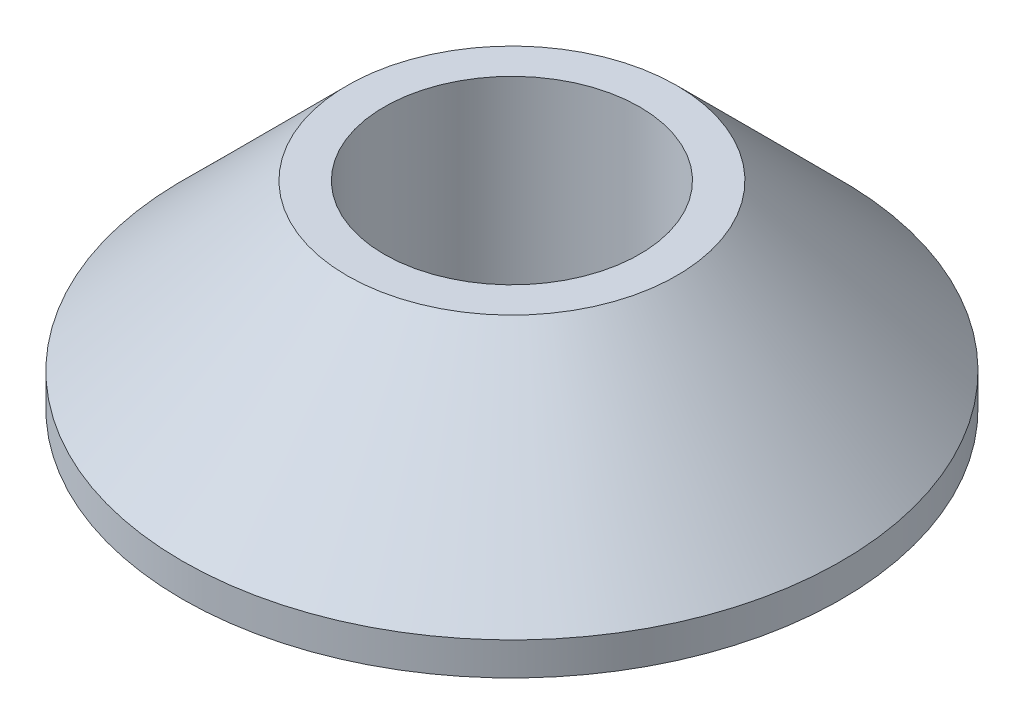
ISO-10303-21;
HEADER;
FILE_DESCRIPTION(('STEP AP214'),'2;1');
FILE_NAME('part.step','',(''),(''),'','','');
FILE_SCHEMA(('AUTOMOTIVE_DESIGN { 1 0 10303 214 1 1 1 1 }'));
ENDSEC;
DATA;
#1=APPLICATION_CONTEXT('core data for automotive mechanical design processes');
#2=APPLICATION_PROTOCOL_DEFINITION('international standard','automotive_design',2000,#1);
#3=PRODUCT_CONTEXT('',#1,'mechanical');
#4=PRODUCT('Part','Part','',(#3));
#5=PRODUCT_RELATED_PRODUCT_CATEGORY('part','',(#4));
#6=PRODUCT_DEFINITION_FORMATION('','',#4);
#7=PRODUCT_DEFINITION_CONTEXT('part definition',#1,'design');
#8=PRODUCT_DEFINITION('design','',#6,#7);
#9=PRODUCT_DEFINITION_SHAPE('','',#8);
#10=(LENGTH_UNIT() NAMED_UNIT(*) SI_UNIT(.MILLI.,.METRE.));
#11=(NAMED_UNIT(*) PLANE_ANGLE_UNIT() SI_UNIT($,.RADIAN.));
#12=(NAMED_UNIT(*) SI_UNIT($,.STERADIAN.) SOLID_ANGLE_UNIT());
#13=UNCERTAINTY_MEASURE_WITH_UNIT(LENGTH_MEASURE(1.E-05),#10,'distance_accuracy_value','');
#14=(GEOMETRIC_REPRESENTATION_CONTEXT(3) GLOBAL_UNCERTAINTY_ASSIGNED_CONTEXT((#13)) GLOBAL_UNIT_ASSIGNED_CONTEXT((#10,
#11,#12)) REPRESENTATION_CONTEXT('',''));
#15=CARTESIAN_POINT('',(0.,0.,0.));
#16=DIRECTION('',(0.,0.,1.));
#17=DIRECTION('',(1.,0.,0.));
#18=AXIS2_PLACEMENT_3D('',#15,#16,#17);
#19=CARTESIAN_POINT('',(0.,24.,0.));
#20=DIRECTION('',(0.,1.,0.));
#21=DIRECTION('',(0.,0.,1.));
#22=AXIS2_PLACEMENT_3D('',#19,#20,#21);
#23=PLANE('',#22);
#24=CARTESIAN_POINT('',(0.,24.,0.));
#25=DIRECTION('',(0.,1.,0.));
#26=DIRECTION('',(0.,0.,1.));
#27=AXIS2_PLACEMENT_3D('',#24,#25,#26);
#28=CIRCLE('',#27,20.);
#29=CARTESIAN_POINT('',(0.,24.,20.));
#30=VERTEX_POINT('',#29);
#31=EDGE_CURVE('E37',#30,#30,#28,.T.);
#32=ORIENTED_EDGE('',*,*,#31,.T.);
#33=EDGE_LOOP('',(#32));
#34=FACE_BOUND('',#33,.T.);
#35=CARTESIAN_POINT('',(0.,24.,0.));
#36=DIRECTION('',(0.,1.,0.));
#37=DIRECTION('',(0.,0.,1.));
#38=AXIS2_PLACEMENT_3D('',#35,#36,#37);
#39=CIRCLE('',#38,15.5);
#40=CARTESIAN_POINT('',(0.,24.,15.5));
#41=VERTEX_POINT('',#40);
#42=EDGE_CURVE('E45',#41,#41,#39,.T.);
#43=ORIENTED_EDGE('',*,*,#42,.F.);
#44=EDGE_LOOP('',(#43));
#45=FACE_BOUND('',#44,.T.);
#46=ADVANCED_FACE('F30',(#34,#45),#23,.T.);
#47=CARTESIAN_POINT('',(0.,0.,0.));
#48=DIRECTION('',(0.,1.,0.));
#49=DIRECTION('',(0.,0.,1.));
#50=AXIS2_PLACEMENT_3D('',#47,#48,#49);
#51=PLANE('',#50);
#52=CARTESIAN_POINT('',(-26.,0.,0.));
#53=DIRECTION('',(0.,-1.,0.));
#54=DIRECTION('',(0.,0.,-1.));
#55=AXIS2_PLACEMENT_3D('',#52,#53,#54);
#56=CIRCLE('',#55,1.5);
#57=CARTESIAN_POINT('',(-26.,0.,-1.50000000000001));
#58=VERTEX_POINT('',#57);
#59=EDGE_CURVE('E72',#58,#58,#56,.T.);
#60=ORIENTED_EDGE('',*,*,#59,.F.);
#61=EDGE_LOOP('',(#60));
#62=FACE_BOUND('',#61,.T.);
#63=CARTESIAN_POINT('',(0.,0.,-26.));
#64=DIRECTION('',(0.,-1.,0.));
#65=DIRECTION('',(0.,0.,-1.));
#66=AXIS2_PLACEMENT_3D('',#63,#64,#65);
#67=CIRCLE('',#66,1.5);
#68=CARTESIAN_POINT('',(0.,0.,-27.5));
#69=VERTEX_POINT('',#68);
#70=EDGE_CURVE('E66',#69,#69,#67,.T.);
#71=ORIENTED_EDGE('',*,*,#70,.F.);
#72=EDGE_LOOP('',(#71));
#73=FACE_BOUND('',#72,.T.);
#74=CARTESIAN_POINT('',(26.,0.,0.));
#75=DIRECTION('',(0.,-1.,0.));
#76=DIRECTION('',(0.,0.,-1.));
#77=AXIS2_PLACEMENT_3D('',#74,#75,#76);
#78=CIRCLE('',#77,1.5);
#79=CARTESIAN_POINT('',(26.,0.,-1.5));
#80=VERTEX_POINT('',#79);
#81=EDGE_CURVE('E60',#80,#80,#78,.T.);
#82=ORIENTED_EDGE('',*,*,#81,.F.);
#83=EDGE_LOOP('',(#82));
#84=FACE_BOUND('',#83,.T.);
#85=CARTESIAN_POINT('',(0.,0.,26.));
#86=DIRECTION('',(0.,-1.,0.));
#87=DIRECTION('',(0.,0.,-1.));
#88=AXIS2_PLACEMENT_3D('',#85,#86,#87);
#89=CIRCLE('',#88,1.5);
#90=CARTESIAN_POINT('',(0.,0.,24.5));
#91=VERTEX_POINT('',#90);
#92=EDGE_CURVE('E54',#91,#91,#89,.T.);
#93=ORIENTED_EDGE('',*,*,#92,.F.);
#94=EDGE_LOOP('',(#93));
#95=FACE_BOUND('',#94,.T.);
#96=CARTESIAN_POINT('',(0.,0.,0.));
#97=DIRECTION('',(0.,1.,0.));
#98=DIRECTION('',(0.,0.,1.));
#99=AXIS2_PLACEMENT_3D('',#96,#97,#98);
#100=CIRCLE('',#99,40.);
#101=CARTESIAN_POINT('',(0.,0.,40.));
#102=VERTEX_POINT('',#101);
#103=EDGE_CURVE('E41',#102,#102,#100,.T.);
#104=ORIENTED_EDGE('',*,*,#103,.F.);
#105=EDGE_LOOP('',(#104));
#106=FACE_BOUND('',#105,.T.);
#107=CARTESIAN_POINT('',(0.,0.,0.));
#108=DIRECTION('',(0.,1.,0.));
#109=DIRECTION('',(0.,0.,1.));
#110=AXIS2_PLACEMENT_3D('',#107,#108,#109);
#111=CIRCLE('',#110,15.5);
#112=CARTESIAN_POINT('',(0.,0.,15.5));
#113=VERTEX_POINT('',#112);
#114=EDGE_CURVE('E48',#113,#113,#111,.T.);
#115=ORIENTED_EDGE('',*,*,#114,.T.);
#116=EDGE_LOOP('',(#115));
#117=FACE_BOUND('',#116,.T.);
#118=ADVANCED_FACE('F87',(#62,#73,#84,#95,#106,#117),#51,.F.);
#119=CARTESIAN_POINT('',(0.,24.,0.));
#120=DIRECTION('',(0.,-1.,0.));
#121=DIRECTION('',(0.,0.,-1.));
#122=AXIS2_PLACEMENT_3D('',#119,#120,#121);
#123=CYLINDRICAL_SURFACE('',#122,40.);
#124=CARTESIAN_POINT('',(0.,3.99999999999994,0.));
#125=DIRECTION('',(0.,1.,0.));
#126=DIRECTION('',(0.,0.,1.));
#127=AXIS2_PLACEMENT_3D('',#124,#125,#126);
#128=CIRCLE('',#127,40.);
#129=CARTESIAN_POINT('',(0.,3.99999999999994,40.));
#130=VERTEX_POINT('',#129);
#131=EDGE_CURVE('E10',#130,#130,#128,.F.);
#132=ORIENTED_EDGE('',*,*,#131,.T.);
#133=EDGE_LOOP('',(#132));
#134=FACE_BOUND('',#133,.T.);
#135=ORIENTED_EDGE('',*,*,#103,.T.);
#136=EDGE_LOOP('',(#135));
#137=FACE_BOUND('',#136,.T.);
#138=ADVANCED_FACE('F90',(#134,#137),#123,.T.);
#139=CARTESIAN_POINT('',(0.,24.,0.));
#140=DIRECTION('',(0.,-1.,0.));
#141=DIRECTION('',(0.,0.,-1.));
#142=AXIS2_PLACEMENT_3D('',#139,#140,#141);
#143=CYLINDRICAL_SURFACE('',#142,15.5);
#144=ORIENTED_EDGE('',*,*,#42,.T.);
#145=EDGE_LOOP('',(#144));
#146=FACE_BOUND('',#145,.T.);
#147=ORIENTED_EDGE('',*,*,#114,.F.);
#148=EDGE_LOOP('',(#147));
#149=FACE_BOUND('',#148,.T.);
#150=ADVANCED_FACE('F102',(#146,#149),#143,.F.);
#151=CARTESIAN_POINT('',(0.,24.,0.));
#152=DIRECTION('',(0.,-1.,0.));
#153=DIRECTION('',(0.,0.,-1.));
#154=AXIS2_PLACEMENT_3D('',#151,#152,#153);
#155=CONICAL_SURFACE('',#154,20.,0.785398163397447);
#156=ORIENTED_EDGE('',*,*,#131,.F.);
#157=EDGE_LOOP('',(#156));
#158=FACE_BOUND('',#157,.T.);
#159=ORIENTED_EDGE('',*,*,#31,.F.);
#160=EDGE_LOOP('',(#159));
#161=FACE_BOUND('',#160,.T.);
#162=ADVANCED_FACE('F32',(#158,#161),#155,.T.);
#163=CARTESIAN_POINT('',(0.,10.,26.));
#164=DIRECTION('',(0.,-1.,0.));
#165=DIRECTION('',(0.,0.,-1.));
#166=AXIS2_PLACEMENT_3D('',#163,#164,#165);
#167=CYLINDRICAL_SURFACE('',#166,1.5);
#168=CARTESIAN_POINT('',(0.,10.,26.));
#169=DIRECTION('',(0.,-1.,0.));
#170=DIRECTION('',(0.,0.,-1.));
#171=AXIS2_PLACEMENT_3D('',#168,#169,#170);
#172=CIRCLE('',#171,1.5);
#173=CARTESIAN_POINT('',(0.,10.,24.5));
#174=VERTEX_POINT('',#173);
#175=EDGE_CURVE('E51',#174,#174,#172,.T.);
#176=ORIENTED_EDGE('',*,*,#175,.F.);
#177=EDGE_LOOP('',(#176));
#178=FACE_BOUND('',#177,.T.);
#179=ORIENTED_EDGE('',*,*,#92,.T.);
#180=EDGE_LOOP('',(#179));
#181=FACE_BOUND('',#180,.T.);
#182=ADVANCED_FACE('F110',(#178,#181),#167,.F.);
#183=CARTESIAN_POINT('',(0.,10.,26.));
#184=DIRECTION('',(0.,-1.,0.));
#185=DIRECTION('',(0.,0.,-1.));
#186=AXIS2_PLACEMENT_3D('',#183,#184,#185);
#187=PLANE('',#186);
#188=ORIENTED_EDGE('',*,*,#175,.T.);
#189=EDGE_LOOP('',(#188));
#190=FACE_BOUND('',#189,.T.);
#191=ADVANCED_FACE('F143',(#190),#187,.T.);
#192=CARTESIAN_POINT('',(26.,10.,0.));
#193=DIRECTION('',(0.,-1.,0.));
#194=DIRECTION('',(0.,0.,-1.));
#195=AXIS2_PLACEMENT_3D('',#192,#193,#194);
#196=CYLINDRICAL_SURFACE('',#195,1.5);
#197=CARTESIAN_POINT('',(26.,10.,0.));
#198=DIRECTION('',(0.,-1.,0.));
#199=DIRECTION('',(0.,0.,-1.));
#200=AXIS2_PLACEMENT_3D('',#197,#198,#199);
#201=CIRCLE('',#200,1.5);
#202=CARTESIAN_POINT('',(26.,10.,-1.5));
#203=VERTEX_POINT('',#202);
#204=EDGE_CURVE('E57',#203,#203,#201,.T.);
#205=ORIENTED_EDGE('',*,*,#204,.F.);
#206=EDGE_LOOP('',(#205));
#207=FACE_BOUND('',#206,.T.);
#208=ORIENTED_EDGE('',*,*,#81,.T.);
#209=EDGE_LOOP('',(#208));
#210=FACE_BOUND('',#209,.T.);
#211=ADVANCED_FACE('F149',(#207,#210),#196,.F.);
#212=CARTESIAN_POINT('',(26.,10.,0.));
#213=DIRECTION('',(0.,-1.,0.));
#214=DIRECTION('',(0.,0.,-1.));
#215=AXIS2_PLACEMENT_3D('',#212,#213,#214);
#216=PLANE('',#215);
#217=ORIENTED_EDGE('',*,*,#204,.T.);
#218=EDGE_LOOP('',(#217));
#219=FACE_BOUND('',#218,.T.);
#220=ADVANCED_FACE('F157',(#219),#216,.T.);
#221=CARTESIAN_POINT('',(0.,10.,-26.));
#222=DIRECTION('',(0.,-1.,0.));
#223=DIRECTION('',(0.,0.,-1.));
#224=AXIS2_PLACEMENT_3D('',#221,#222,#223);
#225=CYLINDRICAL_SURFACE('',#224,1.5);
#226=CARTESIAN_POINT('',(0.,10.,-26.));
#227=DIRECTION('',(0.,-1.,0.));
#228=DIRECTION('',(0.,0.,-1.));
#229=AXIS2_PLACEMENT_3D('',#226,#227,#228);
#230=CIRCLE('',#229,1.5);
#231=CARTESIAN_POINT('',(0.,10.,-27.5));
#232=VERTEX_POINT('',#231);
#233=EDGE_CURVE('E63',#232,#232,#230,.T.);
#234=ORIENTED_EDGE('',*,*,#233,.F.);
#235=EDGE_LOOP('',(#234));
#236=FACE_BOUND('',#235,.T.);
#237=ORIENTED_EDGE('',*,*,#70,.T.);
#238=EDGE_LOOP('',(#237));
#239=FACE_BOUND('',#238,.T.);
#240=ADVANCED_FACE('F165',(#236,#239),#225,.F.);
#241=CARTESIAN_POINT('',(0.,10.,-26.));
#242=DIRECTION('',(0.,-1.,0.));
#243=DIRECTION('',(0.,0.,-1.));
#244=AXIS2_PLACEMENT_3D('',#241,#242,#243);
#245=PLANE('',#244);
#246=ORIENTED_EDGE('',*,*,#233,.T.);
#247=EDGE_LOOP('',(#246));
#248=FACE_BOUND('',#247,.T.);
#249=ADVANCED_FACE('F83',(#248),#245,.T.);
#250=CARTESIAN_POINT('',(-26.,10.,0.));
#251=DIRECTION('',(0.,-1.,0.));
#252=DIRECTION('',(0.,0.,-1.));
#253=AXIS2_PLACEMENT_3D('',#250,#251,#252);
#254=CYLINDRICAL_SURFACE('',#253,1.5);
#255=CARTESIAN_POINT('',(-26.,10.,0.));
#256=DIRECTION('',(0.,-1.,0.));
#257=DIRECTION('',(0.,0.,-1.));
#258=AXIS2_PLACEMENT_3D('',#255,#256,#257);
#259=CIRCLE('',#258,1.5);
#260=CARTESIAN_POINT('',(-26.,10.,-1.50000000000001));
#261=VERTEX_POINT('',#260);
#262=EDGE_CURVE('E69',#261,#261,#259,.T.);
#263=ORIENTED_EDGE('',*,*,#262,.F.);
#264=EDGE_LOOP('',(#263));
#265=FACE_BOUND('',#264,.T.);
#266=ORIENTED_EDGE('',*,*,#59,.T.);
#267=EDGE_LOOP('',(#266));
#268=FACE_BOUND('',#267,.T.);
#269=ADVANCED_FACE('F80',(#265,#268),#254,.F.);
#270=CARTESIAN_POINT('',(-26.,10.,0.));
#271=DIRECTION('',(0.,-1.,0.));
#272=DIRECTION('',(0.,0.,-1.));
#273=AXIS2_PLACEMENT_3D('',#270,#271,#272);
#274=PLANE('',#273);
#275=ORIENTED_EDGE('',*,*,#262,.T.);
#276=EDGE_LOOP('',(#275));
#277=FACE_BOUND('',#276,.T.);
#278=ADVANCED_FACE('F78',(#277),#274,.T.);
#279=CLOSED_SHELL('',(#46,#118,#138,#150,#162,#182,#191,#211,#220,#240,#249,#269,#278));
#280=MANIFOLD_SOLID_BREP('B2',#279);
#281=ADVANCED_BREP_SHAPE_REPRESENTATION('',(#18,#280),#14);
#282=SHAPE_DEFINITION_REPRESENTATION(#9,#281);
ENDSEC;
END-ISO-10303-21;
